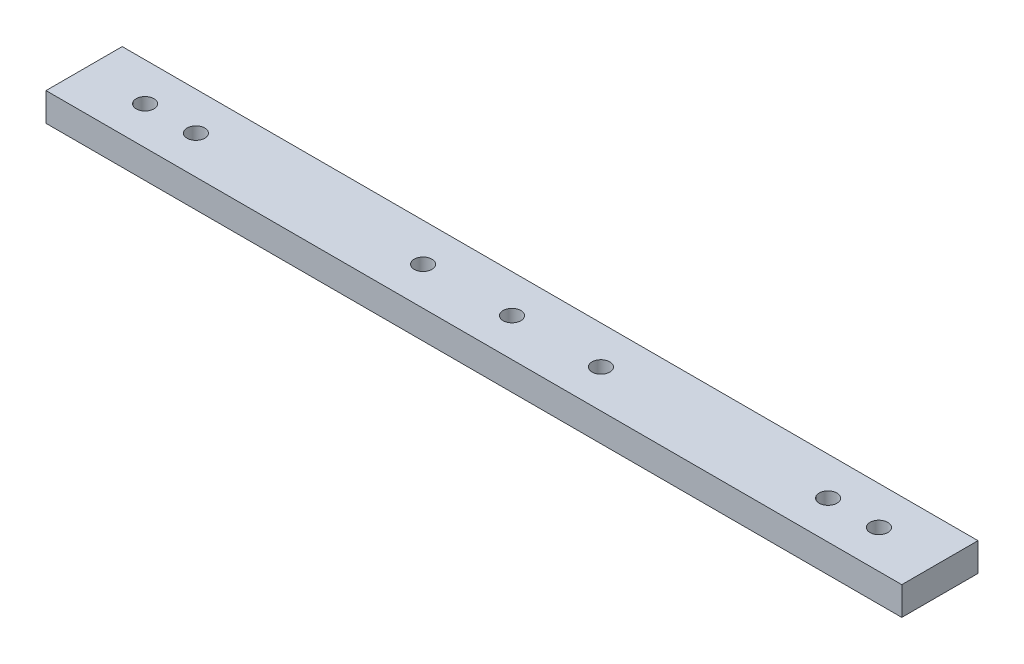
ISO-10303-21;
HEADER;
FILE_DESCRIPTION(('STEP AP214'),'2;1');
FILE_NAME('part.step','',(''),(''),'','','');
FILE_SCHEMA(('AUTOMOTIVE_DESIGN { 1 0 10303 214 1 1 1 1 }'));
ENDSEC;
DATA;
#1=APPLICATION_CONTEXT('core data for automotive mechanical design processes');
#2=APPLICATION_PROTOCOL_DEFINITION('international standard','automotive_design',2000,#1);
#3=PRODUCT_CONTEXT('',#1,'mechanical');
#4=PRODUCT('Part','Part','',(#3));
#5=PRODUCT_RELATED_PRODUCT_CATEGORY('part','',(#4));
#6=PRODUCT_DEFINITION_FORMATION('','',#4);
#7=PRODUCT_DEFINITION_CONTEXT('part definition',#1,'design');
#8=PRODUCT_DEFINITION('design','',#6,#7);
#9=PRODUCT_DEFINITION_SHAPE('','',#8);
#10=(LENGTH_UNIT() NAMED_UNIT(*) SI_UNIT(.MILLI.,.METRE.));
#11=(NAMED_UNIT(*) PLANE_ANGLE_UNIT() SI_UNIT($,.RADIAN.));
#12=(NAMED_UNIT(*) SI_UNIT($,.STERADIAN.) SOLID_ANGLE_UNIT());
#13=UNCERTAINTY_MEASURE_WITH_UNIT(LENGTH_MEASURE(1.E-05),#10,'distance_accuracy_value','');
#14=(GEOMETRIC_REPRESENTATION_CONTEXT(3) GLOBAL_UNCERTAINTY_ASSIGNED_CONTEXT((#13)) GLOBAL_UNIT_ASSIGNED_CONTEXT((#10,
#11,#12)) REPRESENTATION_CONTEXT('',''));
#15=CARTESIAN_POINT('',(0.,0.,0.));
#16=DIRECTION('',(0.,0.,1.));
#17=DIRECTION('',(1.,0.,0.));
#18=AXIS2_PLACEMENT_3D('',#15,#16,#17);
#19=CARTESIAN_POINT('',(-71.3549150414053,5.588,2.97081892022286));
#20=DIRECTION('',(1.,0.,0.));
#21=DIRECTION('',(0.,0.,-1.));
#22=AXIS2_PLACEMENT_3D('',#19,#20,#21);
#23=PLANE('',#22);
#24=DIRECTION('',(0.,0.,1.));
#25=VECTOR('',#24,1.);
#26=CARTESIAN_POINT('',(-71.3549150414053,0.,2.97081892022286));
#27=LINE('',#26,#25);
#28=CARTESIAN_POINT('',(-71.3549150414053,0.,-12.0291810797771));
#29=VERTEX_POINT('',#28);
#30=CARTESIAN_POINT('',(-71.3549150414053,0.,2.97081892022286));
#31=VERTEX_POINT('',#30);
#32=EDGE_CURVE('E96',#29,#31,#27,.T.);
#33=ORIENTED_EDGE('',*,*,#32,.T.);
#34=DIRECTION('',(0.,-1.,0.));
#35=VECTOR('',#34,1.);
#36=CARTESIAN_POINT('',(-71.3549150414053,5.588,2.97081892022286));
#37=LINE('',#36,#35);
#38=CARTESIAN_POINT('',(-71.3549150414053,5.588,2.97081892022286));
#39=VERTEX_POINT('',#38);
#40=EDGE_CURVE('E11',#39,#31,#37,.T.);
#41=ORIENTED_EDGE('',*,*,#40,.F.);
#42=DIRECTION('',(0.,0.,1.));
#43=VECTOR('',#42,1.);
#44=CARTESIAN_POINT('',(-71.3549150414053,5.588,2.97081892022286));
#45=LINE('',#44,#43);
#46=CARTESIAN_POINT('',(-71.3549150414053,5.588,-12.0291810797771));
#47=VERTEX_POINT('',#46);
#48=EDGE_CURVE('E84',#47,#39,#45,.T.);
#49=ORIENTED_EDGE('',*,*,#48,.F.);
#50=DIRECTION('',(0.,-1.,0.));
#51=VECTOR('',#50,1.);
#52=CARTESIAN_POINT('',(-71.3549150414053,5.588,-12.0291810797771));
#53=LINE('',#52,#51);
#54=EDGE_CURVE('E92',#47,#29,#53,.T.);
#55=ORIENTED_EDGE('',*,*,#54,.T.);
#56=EDGE_LOOP('',(#33,#41,#49,#55));
#57=FACE_BOUND('',#56,.T.);
#58=ADVANCED_FACE('F33',(#57),#23,.F.);
#59=CARTESIAN_POINT('',(-71.3549150414053,5.588,2.97081892022286));
#60=DIRECTION('',(0.,0.,-1.));
#61=DIRECTION('',(-1.,0.,0.));
#62=AXIS2_PLACEMENT_3D('',#59,#60,#61);
#63=PLANE('',#62);
#64=DIRECTION('',(1.,0.,0.));
#65=VECTOR('',#64,1.);
#66=CARTESIAN_POINT('',(-71.3549150414053,0.,2.97081892022286));
#67=LINE('',#66,#65);
#68=CARTESIAN_POINT('',(97.0570849585947,0.,2.97081892022286));
#69=VERTEX_POINT('',#68);
#70=EDGE_CURVE('E88',#31,#69,#67,.T.);
#71=ORIENTED_EDGE('',*,*,#70,.T.);
#72=DIRECTION('',(0.,-1.,0.));
#73=VECTOR('',#72,1.);
#74=CARTESIAN_POINT('',(97.0570849585947,5.588,2.97081892022286));
#75=LINE('',#74,#73);
#76=CARTESIAN_POINT('',(97.0570849585947,5.588,2.97081892022286));
#77=VERTEX_POINT('',#76);
#78=EDGE_CURVE('E41',#77,#69,#75,.T.);
#79=ORIENTED_EDGE('',*,*,#78,.F.);
#80=DIRECTION('',(1.,0.,0.));
#81=VECTOR('',#80,1.);
#82=CARTESIAN_POINT('',(-71.3549150414053,5.588,2.97081892022286));
#83=LINE('',#82,#81);
#84=EDGE_CURVE('E79',#39,#77,#83,.T.);
#85=ORIENTED_EDGE('',*,*,#84,.F.);
#86=ORIENTED_EDGE('',*,*,#40,.T.);
#87=EDGE_LOOP('',(#71,#79,#85,#86));
#88=FACE_BOUND('',#87,.T.);
#89=ADVANCED_FACE('F87',(#88),#63,.F.);
#90=CARTESIAN_POINT('',(97.0570849585947,5.588,2.97081892022286));
#91=DIRECTION('',(-1.,0.,0.));
#92=DIRECTION('',(0.,0.,1.));
#93=AXIS2_PLACEMENT_3D('',#90,#91,#92);
#94=PLANE('',#93);
#95=DIRECTION('',(0.,0.,-1.));
#96=VECTOR('',#95,1.);
#97=CARTESIAN_POINT('',(97.0570849585947,0.,2.97081892022286));
#98=LINE('',#97,#96);
#99=CARTESIAN_POINT('',(97.0570849585947,0.,-12.0291810797771));
#100=VERTEX_POINT('',#99);
#101=EDGE_CURVE('E66',#69,#100,#98,.T.);
#102=ORIENTED_EDGE('',*,*,#101,.T.);
#103=DIRECTION('',(0.,-1.,0.));
#104=VECTOR('',#103,1.);
#105=CARTESIAN_POINT('',(97.0570849585947,5.588,-12.0291810797771));
#106=LINE('',#105,#104);
#107=CARTESIAN_POINT('',(97.0570849585947,5.588,-12.0291810797771));
#108=VERTEX_POINT('',#107);
#109=EDGE_CURVE('E89',#108,#100,#106,.T.);
#110=ORIENTED_EDGE('',*,*,#109,.F.);
#111=DIRECTION('',(0.,0.,-1.));
#112=VECTOR('',#111,1.);
#113=CARTESIAN_POINT('',(97.0570849585947,5.588,2.97081892022286));
#114=LINE('',#113,#112);
#115=EDGE_CURVE('E82',#77,#108,#114,.T.);
#116=ORIENTED_EDGE('',*,*,#115,.F.);
#117=ORIENTED_EDGE('',*,*,#78,.T.);
#118=EDGE_LOOP('',(#102,#110,#116,#117));
#119=FACE_BOUND('',#118,.T.);
#120=ADVANCED_FACE('F90',(#119),#94,.F.);
#121=CARTESIAN_POINT('',(-71.3549150414053,5.588,-12.0291810797771));
#122=DIRECTION('',(0.,0.,1.));
#123=DIRECTION('',(1.,0.,0.));
#124=AXIS2_PLACEMENT_3D('',#121,#122,#123);
#125=PLANE('',#124);
#126=DIRECTION('',(-1.,0.,0.));
#127=VECTOR('',#126,1.);
#128=CARTESIAN_POINT('',(-71.3549150414053,0.,-12.0291810797771));
#129=LINE('',#128,#127);
#130=EDGE_CURVE('E72',#100,#29,#129,.T.);
#131=ORIENTED_EDGE('',*,*,#130,.T.);
#132=ORIENTED_EDGE('',*,*,#54,.F.);
#133=DIRECTION('',(-1.,0.,0.));
#134=VECTOR('',#133,1.);
#135=CARTESIAN_POINT('',(-71.3549150414053,5.588,-12.0291810797771));
#136=LINE('',#135,#134);
#137=EDGE_CURVE('E49',#108,#47,#136,.T.);
#138=ORIENTED_EDGE('',*,*,#137,.F.);
#139=ORIENTED_EDGE('',*,*,#109,.T.);
#140=EDGE_LOOP('',(#131,#132,#138,#139));
#141=FACE_BOUND('',#140,.T.);
#142=ADVANCED_FACE('F104',(#141),#125,.F.);
#143=CARTESIAN_POINT('',(0.,5.588,0.));
#144=DIRECTION('',(0.,-1.,0.));
#145=DIRECTION('',(0.,0.,-1.));
#146=AXIS2_PLACEMENT_3D('',#143,#144,#145);
#147=PLANE('',#146);
#148=CARTESIAN_POINT('',(12.8510849585947,5.588,-4.52918107977712));
#149=DIRECTION('',(0.,1.,0.));
#150=DIRECTION('',(0.,0.,1.));
#151=AXIS2_PLACEMENT_3D('',#148,#149,#150);
#152=CIRCLE('',#151,1.75);
#153=CARTESIAN_POINT('',(12.8510849585947,5.588,-2.77918107977712));
#154=VERTEX_POINT('',#153);
#155=EDGE_CURVE('E146',#154,#154,#152,.T.);
#156=ORIENTED_EDGE('',*,*,#155,.F.);
#157=EDGE_LOOP('',(#156));
#158=FACE_BOUND('',#157,.T.);
#159=CARTESIAN_POINT('',(30.3510849585947,5.588,-4.52918107977713));
#160=DIRECTION('',(0.,1.,0.));
#161=DIRECTION('',(0.,0.,1.));
#162=AXIS2_PLACEMENT_3D('',#159,#160,#161);
#163=CIRCLE('',#162,1.75);
#164=CARTESIAN_POINT('',(30.3510849585947,5.588,-2.77918107977713));
#165=VERTEX_POINT('',#164);
#166=EDGE_CURVE('E140',#165,#165,#163,.T.);
#167=ORIENTED_EDGE('',*,*,#166,.F.);
#168=EDGE_LOOP('',(#167));
#169=FACE_BOUND('',#168,.T.);
#170=CARTESIAN_POINT('',(-4.64891504140531,5.588,-4.52918107977712));
#171=DIRECTION('',(0.,1.,0.));
#172=DIRECTION('',(0.,0.,1.));
#173=AXIS2_PLACEMENT_3D('',#170,#171,#172);
#174=CIRCLE('',#173,1.75);
#175=CARTESIAN_POINT('',(-4.64891504140531,5.588,-2.77918107977712));
#176=VERTEX_POINT('',#175);
#177=EDGE_CURVE('E134',#176,#176,#174,.T.);
#178=ORIENTED_EDGE('',*,*,#177,.F.);
#179=EDGE_LOOP('',(#178));
#180=FACE_BOUND('',#179,.T.);
#181=CARTESIAN_POINT('',(85.0570849585947,5.588,-4.52918107977714));
#182=DIRECTION('',(0.,1.,0.));
#183=DIRECTION('',(0.,0.,1.));
#184=AXIS2_PLACEMENT_3D('',#181,#182,#183);
#185=CIRCLE('',#184,1.75);
#186=CARTESIAN_POINT('',(85.0570849585947,5.588,-2.77918107977715));
#187=VERTEX_POINT('',#186);
#188=EDGE_CURVE('E128',#187,#187,#185,.T.);
#189=ORIENTED_EDGE('',*,*,#188,.F.);
#190=EDGE_LOOP('',(#189));
#191=FACE_BOUND('',#190,.T.);
#192=CARTESIAN_POINT('',(75.0570849585947,5.588,-4.52918107977714));
#193=DIRECTION('',(0.,1.,0.));
#194=DIRECTION('',(0.,0.,1.));
#195=AXIS2_PLACEMENT_3D('',#192,#193,#194);
#196=CIRCLE('',#195,1.75);
#197=CARTESIAN_POINT('',(75.0570849585947,5.588,-2.77918107977715));
#198=VERTEX_POINT('',#197);
#199=EDGE_CURVE('E122',#198,#198,#196,.T.);
#200=ORIENTED_EDGE('',*,*,#199,.F.);
#201=EDGE_LOOP('',(#200));
#202=FACE_BOUND('',#201,.T.);
#203=CARTESIAN_POINT('',(-49.3549150414053,5.588,-4.52918107977714));
#204=DIRECTION('',(0.,1.,0.));
#205=DIRECTION('',(0.,0.,1.));
#206=AXIS2_PLACEMENT_3D('',#203,#204,#205);
#207=CIRCLE('',#206,1.75);
#208=CARTESIAN_POINT('',(-49.3549150414053,5.588,-2.77918107977714));
#209=VERTEX_POINT('',#208);
#210=EDGE_CURVE('E116',#209,#209,#207,.T.);
#211=ORIENTED_EDGE('',*,*,#210,.F.);
#212=EDGE_LOOP('',(#211));
#213=FACE_BOUND('',#212,.T.);
#214=CARTESIAN_POINT('',(-59.3549150414053,5.588,-4.52918107977714));
#215=DIRECTION('',(0.,1.,0.));
#216=DIRECTION('',(0.,0.,1.));
#217=AXIS2_PLACEMENT_3D('',#214,#215,#216);
#218=CIRCLE('',#217,1.75);
#219=CARTESIAN_POINT('',(-59.3549150414053,5.588,-2.77918107977715));
#220=VERTEX_POINT('',#219);
#221=EDGE_CURVE('E110',#220,#220,#218,.T.);
#222=ORIENTED_EDGE('',*,*,#221,.F.);
#223=EDGE_LOOP('',(#222));
#224=FACE_BOUND('',#223,.T.);
#225=ORIENTED_EDGE('',*,*,#48,.T.);
#226=ORIENTED_EDGE('',*,*,#84,.T.);
#227=ORIENTED_EDGE('',*,*,#115,.T.);
#228=ORIENTED_EDGE('',*,*,#137,.T.);
#229=EDGE_LOOP('',(#225,#226,#227,#228));
#230=FACE_BOUND('',#229,.T.);
#231=ADVANCED_FACE('F80',(#158,#169,#180,#191,#202,#213,#224,#230),#147,.F.);
#232=CARTESIAN_POINT('',(0.,0.,0.));
#233=DIRECTION('',(0.,-1.,0.));
#234=DIRECTION('',(0.,0.,-1.));
#235=AXIS2_PLACEMENT_3D('',#232,#233,#234);
#236=PLANE('',#235);
#237=CARTESIAN_POINT('',(12.8510849585947,0.,-4.52918107977712));
#238=DIRECTION('',(0.,1.,0.));
#239=DIRECTION('',(0.,0.,1.));
#240=AXIS2_PLACEMENT_3D('',#237,#238,#239);
#241=CIRCLE('',#240,1.75);
#242=CARTESIAN_POINT('',(12.8510849585947,0.,-2.77918107977712));
#243=VERTEX_POINT('',#242);
#244=EDGE_CURVE('E143',#243,#243,#241,.T.);
#245=ORIENTED_EDGE('',*,*,#244,.T.);
#246=EDGE_LOOP('',(#245));
#247=FACE_BOUND('',#246,.T.);
#248=CARTESIAN_POINT('',(30.3510849585947,0.,-4.52918107977713));
#249=DIRECTION('',(0.,1.,0.));
#250=DIRECTION('',(0.,0.,1.));
#251=AXIS2_PLACEMENT_3D('',#248,#249,#250);
#252=CIRCLE('',#251,1.75);
#253=CARTESIAN_POINT('',(30.3510849585947,0.,-2.77918107977713));
#254=VERTEX_POINT('',#253);
#255=EDGE_CURVE('E137',#254,#254,#252,.T.);
#256=ORIENTED_EDGE('',*,*,#255,.T.);
#257=EDGE_LOOP('',(#256));
#258=FACE_BOUND('',#257,.T.);
#259=CARTESIAN_POINT('',(-4.64891504140531,0.,-4.52918107977712));
#260=DIRECTION('',(0.,1.,0.));
#261=DIRECTION('',(0.,0.,1.));
#262=AXIS2_PLACEMENT_3D('',#259,#260,#261);
#263=CIRCLE('',#262,1.75);
#264=CARTESIAN_POINT('',(-4.64891504140531,0.,-2.77918107977712));
#265=VERTEX_POINT('',#264);
#266=EDGE_CURVE('E131',#265,#265,#263,.T.);
#267=ORIENTED_EDGE('',*,*,#266,.T.);
#268=EDGE_LOOP('',(#267));
#269=FACE_BOUND('',#268,.T.);
#270=CARTESIAN_POINT('',(85.0570849585947,0.,-4.52918107977714));
#271=DIRECTION('',(0.,1.,0.));
#272=DIRECTION('',(0.,0.,1.));
#273=AXIS2_PLACEMENT_3D('',#270,#271,#272);
#274=CIRCLE('',#273,1.75);
#275=CARTESIAN_POINT('',(85.0570849585947,0.,-2.77918107977715));
#276=VERTEX_POINT('',#275);
#277=EDGE_CURVE('E125',#276,#276,#274,.T.);
#278=ORIENTED_EDGE('',*,*,#277,.T.);
#279=EDGE_LOOP('',(#278));
#280=FACE_BOUND('',#279,.T.);
#281=CARTESIAN_POINT('',(75.0570849585947,0.,-4.52918107977714));
#282=DIRECTION('',(0.,1.,0.));
#283=DIRECTION('',(0.,0.,1.));
#284=AXIS2_PLACEMENT_3D('',#281,#282,#283);
#285=CIRCLE('',#284,1.75);
#286=CARTESIAN_POINT('',(75.0570849585947,0.,-2.77918107977715));
#287=VERTEX_POINT('',#286);
#288=EDGE_CURVE('E119',#287,#287,#285,.T.);
#289=ORIENTED_EDGE('',*,*,#288,.T.);
#290=EDGE_LOOP('',(#289));
#291=FACE_BOUND('',#290,.T.);
#292=CARTESIAN_POINT('',(-49.3549150414053,0.,-4.52918107977714));
#293=DIRECTION('',(0.,1.,0.));
#294=DIRECTION('',(0.,0.,1.));
#295=AXIS2_PLACEMENT_3D('',#292,#293,#294);
#296=CIRCLE('',#295,1.75);
#297=CARTESIAN_POINT('',(-49.3549150414053,0.,-2.77918107977714));
#298=VERTEX_POINT('',#297);
#299=EDGE_CURVE('E113',#298,#298,#296,.T.);
#300=ORIENTED_EDGE('',*,*,#299,.T.);
#301=EDGE_LOOP('',(#300));
#302=FACE_BOUND('',#301,.T.);
#303=CARTESIAN_POINT('',(-59.3549150414053,0.,-4.52918107977714));
#304=DIRECTION('',(0.,1.,0.));
#305=DIRECTION('',(0.,0.,1.));
#306=AXIS2_PLACEMENT_3D('',#303,#304,#305);
#307=CIRCLE('',#306,1.75);
#308=CARTESIAN_POINT('',(-59.3549150414053,0.,-2.77918107977715));
#309=VERTEX_POINT('',#308);
#310=EDGE_CURVE('E99',#309,#309,#307,.T.);
#311=ORIENTED_EDGE('',*,*,#310,.T.);
#312=EDGE_LOOP('',(#311));
#313=FACE_BOUND('',#312,.T.);
#314=ORIENTED_EDGE('',*,*,#32,.F.);
#315=ORIENTED_EDGE('',*,*,#130,.F.);
#316=ORIENTED_EDGE('',*,*,#101,.F.);
#317=ORIENTED_EDGE('',*,*,#70,.F.);
#318=EDGE_LOOP('',(#314,#315,#316,#317));
#319=FACE_BOUND('',#318,.T.);
#320=ADVANCED_FACE('F107',(#247,#258,#269,#280,#291,#302,#313,#319),#236,.T.);
#321=CARTESIAN_POINT('',(-59.3549150414053,0.,-4.52918107977714));
#322=DIRECTION('',(0.,1.,0.));
#323=DIRECTION('',(0.,0.,1.));
#324=AXIS2_PLACEMENT_3D('',#321,#322,#323);
#325=CYLINDRICAL_SURFACE('',#324,1.75);
#326=ORIENTED_EDGE('',*,*,#310,.F.);
#327=EDGE_LOOP('',(#326));
#328=FACE_BOUND('',#327,.T.);
#329=ORIENTED_EDGE('',*,*,#221,.T.);
#330=EDGE_LOOP('',(#329));
#331=FACE_BOUND('',#330,.T.);
#332=ADVANCED_FACE('F176',(#328,#331),#325,.F.);
#333=CARTESIAN_POINT('',(-49.3549150414053,0.,-4.52918107977714));
#334=DIRECTION('',(0.,1.,0.));
#335=DIRECTION('',(0.,0.,1.));
#336=AXIS2_PLACEMENT_3D('',#333,#334,#335);
#337=CYLINDRICAL_SURFACE('',#336,1.75);
#338=ORIENTED_EDGE('',*,*,#299,.F.);
#339=EDGE_LOOP('',(#338));
#340=FACE_BOUND('',#339,.T.);
#341=ORIENTED_EDGE('',*,*,#210,.T.);
#342=EDGE_LOOP('',(#341));
#343=FACE_BOUND('',#342,.T.);
#344=ADVANCED_FACE('F178',(#340,#343),#337,.F.);
#345=CARTESIAN_POINT('',(75.0570849585947,0.,-4.52918107977714));
#346=DIRECTION('',(0.,1.,0.));
#347=DIRECTION('',(0.,0.,1.));
#348=AXIS2_PLACEMENT_3D('',#345,#346,#347);
#349=CYLINDRICAL_SURFACE('',#348,1.75);
#350=ORIENTED_EDGE('',*,*,#288,.F.);
#351=EDGE_LOOP('',(#350));
#352=FACE_BOUND('',#351,.T.);
#353=ORIENTED_EDGE('',*,*,#199,.T.);
#354=EDGE_LOOP('',(#353));
#355=FACE_BOUND('',#354,.T.);
#356=ADVANCED_FACE('F185',(#352,#355),#349,.F.);
#357=CARTESIAN_POINT('',(85.0570849585947,0.,-4.52918107977714));
#358=DIRECTION('',(0.,1.,0.));
#359=DIRECTION('',(0.,0.,1.));
#360=AXIS2_PLACEMENT_3D('',#357,#358,#359);
#361=CYLINDRICAL_SURFACE('',#360,1.75);
#362=ORIENTED_EDGE('',*,*,#277,.F.);
#363=EDGE_LOOP('',(#362));
#364=FACE_BOUND('',#363,.T.);
#365=ORIENTED_EDGE('',*,*,#188,.T.);
#366=EDGE_LOOP('',(#365));
#367=FACE_BOUND('',#366,.T.);
#368=ADVANCED_FACE('F226',(#364,#367),#361,.F.);
#369=CARTESIAN_POINT('',(-4.64891504140531,0.,-4.52918107977712));
#370=DIRECTION('',(0.,1.,0.));
#371=DIRECTION('',(0.,0.,1.));
#372=AXIS2_PLACEMENT_3D('',#369,#370,#371);
#373=CYLINDRICAL_SURFACE('',#372,1.75);
#374=ORIENTED_EDGE('',*,*,#266,.F.);
#375=EDGE_LOOP('',(#374));
#376=FACE_BOUND('',#375,.T.);
#377=ORIENTED_EDGE('',*,*,#177,.T.);
#378=EDGE_LOOP('',(#377));
#379=FACE_BOUND('',#378,.T.);
#380=ADVANCED_FACE('F221',(#376,#379),#373,.F.);
#381=CARTESIAN_POINT('',(30.3510849585947,0.,-4.52918107977713));
#382=DIRECTION('',(0.,1.,0.));
#383=DIRECTION('',(0.,0.,1.));
#384=AXIS2_PLACEMENT_3D('',#381,#382,#383);
#385=CYLINDRICAL_SURFACE('',#384,1.75);
#386=ORIENTED_EDGE('',*,*,#255,.F.);
#387=EDGE_LOOP('',(#386));
#388=FACE_BOUND('',#387,.T.);
#389=ORIENTED_EDGE('',*,*,#166,.T.);
#390=EDGE_LOOP('',(#389));
#391=FACE_BOUND('',#390,.T.);
#392=ADVANCED_FACE('F157',(#388,#391),#385,.F.);
#393=CARTESIAN_POINT('',(12.8510849585947,0.,-4.52918107977712));
#394=DIRECTION('',(0.,1.,0.));
#395=DIRECTION('',(0.,0.,1.));
#396=AXIS2_PLACEMENT_3D('',#393,#394,#395);
#397=CYLINDRICAL_SURFACE('',#396,1.75);
#398=ORIENTED_EDGE('',*,*,#244,.F.);
#399=EDGE_LOOP('',(#398));
#400=FACE_BOUND('',#399,.T.);
#401=ORIENTED_EDGE('',*,*,#155,.T.);
#402=EDGE_LOOP('',(#401));
#403=FACE_BOUND('',#402,.T.);
#404=ADVANCED_FACE('F154',(#400,#403),#397,.F.);
#405=CLOSED_SHELL('',(#58,#89,#120,#142,#231,#320,#332,#344,#356,#368,#380,#392,#404));
#406=MANIFOLD_SOLID_BREP('B2',#405);
#407=ADVANCED_BREP_SHAPE_REPRESENTATION('',(#18,#406),#14);
#408=SHAPE_DEFINITION_REPRESENTATION(#9,#407);
ENDSEC;
END-ISO-10303-21;
